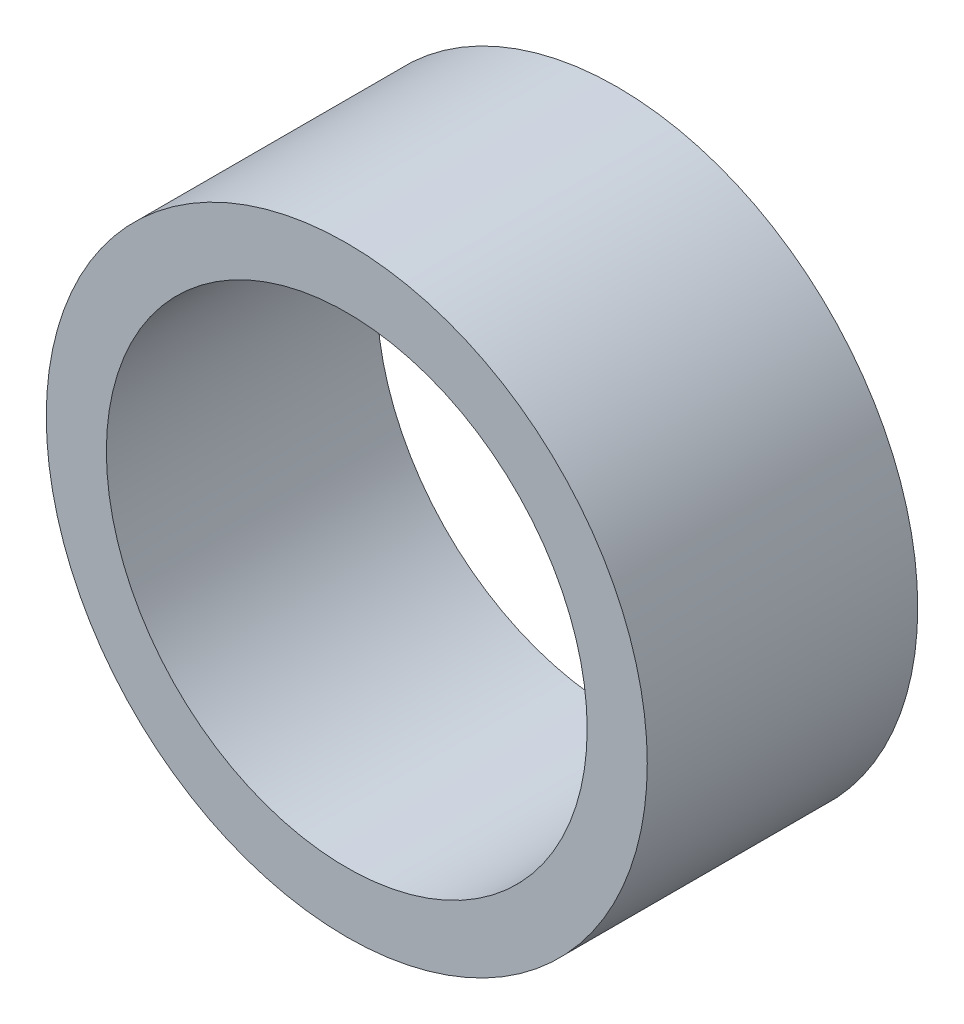
ISO-10303-21;
HEADER;
FILE_DESCRIPTION(('STEP AP214'),'2;1');
FILE_NAME('part.step','',(''),(''),'','','');
FILE_SCHEMA(('AUTOMOTIVE_DESIGN { 1 0 10303 214 1 1 1 1 }'));
ENDSEC;
DATA;
#1=APPLICATION_CONTEXT('core data for automotive mechanical design processes');
#2=APPLICATION_PROTOCOL_DEFINITION('international standard','automotive_design',2000,#1);
#3=PRODUCT_CONTEXT('',#1,'mechanical');
#4=PRODUCT('Part','Part','',(#3));
#5=PRODUCT_RELATED_PRODUCT_CATEGORY('part','',(#4));
#6=PRODUCT_DEFINITION_FORMATION('','',#4);
#7=PRODUCT_DEFINITION_CONTEXT('part definition',#1,'design');
#8=PRODUCT_DEFINITION('design','',#6,#7);
#9=PRODUCT_DEFINITION_SHAPE('','',#8);
#10=(LENGTH_UNIT() NAMED_UNIT(*) SI_UNIT(.MILLI.,.METRE.));
#11=(NAMED_UNIT(*) PLANE_ANGLE_UNIT() SI_UNIT($,.RADIAN.));
#12=(NAMED_UNIT(*) SI_UNIT($,.STERADIAN.) SOLID_ANGLE_UNIT());
#13=UNCERTAINTY_MEASURE_WITH_UNIT(LENGTH_MEASURE(1.E-05),#10,'distance_accuracy_value','');
#14=(GEOMETRIC_REPRESENTATION_CONTEXT(3) GLOBAL_UNCERTAINTY_ASSIGNED_CONTEXT((#13)) GLOBAL_UNIT_ASSIGNED_CONTEXT((#10,
#11,#12)) REPRESENTATION_CONTEXT('',''));
#15=CARTESIAN_POINT('',(0.,0.,0.));
#16=DIRECTION('',(0.,0.,1.));
#17=DIRECTION('',(1.,0.,0.));
#18=AXIS2_PLACEMENT_3D('',#15,#16,#17);
#19=CARTESIAN_POINT('',(0.,0.,11.43));
#20=DIRECTION('',(0.,0.,-1.));
#21=DIRECTION('',(-1.,0.,0.));
#22=AXIS2_PLACEMENT_3D('',#19,#20,#21);
#23=CYLINDRICAL_SURFACE('',#22,12.7);
#24=CARTESIAN_POINT('',(0.,0.,11.43));
#25=DIRECTION('',(0.,0.,1.));
#26=DIRECTION('',(1.,0.,0.));
#27=AXIS2_PLACEMENT_3D('',#24,#25,#26);
#28=CIRCLE('',#27,12.7);
#29=CARTESIAN_POINT('',(12.7,0.,11.43));
#30=VERTEX_POINT('',#29);
#31=EDGE_CURVE('E10',#30,#30,#28,.T.);
#32=ORIENTED_EDGE('',*,*,#31,.F.);
#33=EDGE_LOOP('',(#32));
#34=FACE_BOUND('',#33,.T.);
#35=CARTESIAN_POINT('',(0.,0.,0.));
#36=DIRECTION('',(0.,0.,1.));
#37=DIRECTION('',(1.,0.,0.));
#38=AXIS2_PLACEMENT_3D('',#35,#36,#37);
#39=CIRCLE('',#38,12.7);
#40=CARTESIAN_POINT('',(12.7,0.,0.));
#41=VERTEX_POINT('',#40);
#42=EDGE_CURVE('E36',#41,#41,#39,.T.);
#43=ORIENTED_EDGE('',*,*,#42,.T.);
#44=EDGE_LOOP('',(#43));
#45=FACE_BOUND('',#44,.T.);
#46=ADVANCED_FACE('F33',(#34,#45),#23,.T.);
#47=CARTESIAN_POINT('',(0.,0.,11.43));
#48=DIRECTION('',(0.,0.,1.));
#49=DIRECTION('',(1.,0.,0.));
#50=AXIS2_PLACEMENT_3D('',#47,#48,#49);
#51=PLANE('',#50);
#52=CARTESIAN_POINT('',(0.,0.,11.43));
#53=DIRECTION('',(0.,0.,1.));
#54=DIRECTION('',(1.,0.,0.));
#55=AXIS2_PLACEMENT_3D('',#52,#53,#54);
#56=CIRCLE('',#55,10.16);
#57=CARTESIAN_POINT('',(10.16,0.,11.43));
#58=VERTEX_POINT('',#57);
#59=EDGE_CURVE('E45',#58,#58,#56,.T.);
#60=ORIENTED_EDGE('',*,*,#59,.F.);
#61=EDGE_LOOP('',(#60));
#62=FACE_BOUND('',#61,.T.);
#63=ORIENTED_EDGE('',*,*,#31,.T.);
#64=EDGE_LOOP('',(#63));
#65=FACE_BOUND('',#64,.T.);
#66=ADVANCED_FACE('F60',(#62,#65),#51,.T.);
#67=CARTESIAN_POINT('',(0.,0.,0.));
#68=DIRECTION('',(0.,0.,1.));
#69=DIRECTION('',(1.,0.,0.));
#70=AXIS2_PLACEMENT_3D('',#67,#68,#69);
#71=PLANE('',#70);
#72=CARTESIAN_POINT('',(0.,0.,0.));
#73=DIRECTION('',(0.,0.,1.));
#74=DIRECTION('',(1.,0.,0.));
#75=AXIS2_PLACEMENT_3D('',#72,#73,#74);
#76=CIRCLE('',#75,10.16);
#77=CARTESIAN_POINT('',(10.16,0.,0.));
#78=VERTEX_POINT('',#77);
#79=EDGE_CURVE('E43',#78,#78,#76,.T.);
#80=ORIENTED_EDGE('',*,*,#79,.T.);
#81=EDGE_LOOP('',(#80));
#82=FACE_BOUND('',#81,.T.);
#83=ORIENTED_EDGE('',*,*,#42,.F.);
#84=EDGE_LOOP('',(#83));
#85=FACE_BOUND('',#84,.T.);
#86=ADVANCED_FACE('F51',(#82,#85),#71,.F.);
#87=CARTESIAN_POINT('',(0.,0.,0.));
#88=DIRECTION('',(0.,0.,1.));
#89=DIRECTION('',(1.,0.,0.));
#90=AXIS2_PLACEMENT_3D('',#87,#88,#89);
#91=CYLINDRICAL_SURFACE('',#90,10.16);
#92=ORIENTED_EDGE('',*,*,#79,.F.);
#93=EDGE_LOOP('',(#92));
#94=FACE_BOUND('',#93,.T.);
#95=ORIENTED_EDGE('',*,*,#59,.T.);
#96=EDGE_LOOP('',(#95));
#97=FACE_BOUND('',#96,.T.);
#98=ADVANCED_FACE('F54',(#94,#97),#91,.F.);
#99=CLOSED_SHELL('',(#46,#66,#86,#98));
#100=MANIFOLD_SOLID_BREP('B2',#99);
#101=ADVANCED_BREP_SHAPE_REPRESENTATION('',(#18,#100),#14);
#102=SHAPE_DEFINITION_REPRESENTATION(#9,#101);
ENDSEC;
END-ISO-10303-21;
